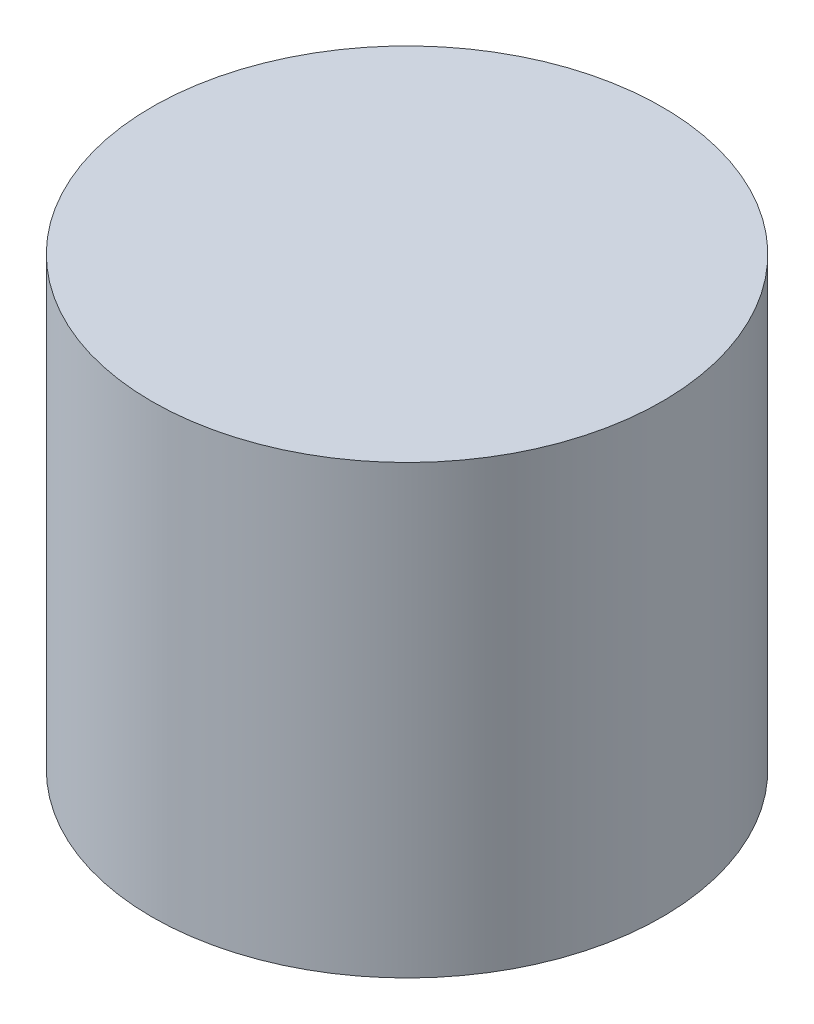
ISO-10303-21;
HEADER;
FILE_DESCRIPTION(('STEP AP214'),'2;1');
FILE_NAME('part.step','',(''),(''),'','','');
FILE_SCHEMA(('AUTOMOTIVE_DESIGN { 1 0 10303 214 1 1 1 1 }'));
ENDSEC;
DATA;
#1=APPLICATION_CONTEXT('core data for automotive mechanical design processes');
#2=APPLICATION_PROTOCOL_DEFINITION('international standard','automotive_design',2000,#1);
#3=PRODUCT_CONTEXT('',#1,'mechanical');
#4=PRODUCT('Part','Part','',(#3));
#5=PRODUCT_RELATED_PRODUCT_CATEGORY('part','',(#4));
#6=PRODUCT_DEFINITION_FORMATION('','',#4);
#7=PRODUCT_DEFINITION_CONTEXT('part definition',#1,'design');
#8=PRODUCT_DEFINITION('design','',#6,#7);
#9=PRODUCT_DEFINITION_SHAPE('','',#8);
#10=(LENGTH_UNIT() NAMED_UNIT(*) SI_UNIT(.MILLI.,.METRE.));
#11=(NAMED_UNIT(*) PLANE_ANGLE_UNIT() SI_UNIT($,.RADIAN.));
#12=(NAMED_UNIT(*) SI_UNIT($,.STERADIAN.) SOLID_ANGLE_UNIT());
#13=UNCERTAINTY_MEASURE_WITH_UNIT(LENGTH_MEASURE(1.E-05),#10,'distance_accuracy_value','');
#14=(GEOMETRIC_REPRESENTATION_CONTEXT(3) GLOBAL_UNCERTAINTY_ASSIGNED_CONTEXT((#13)) GLOBAL_UNIT_ASSIGNED_CONTEXT((#10,
#11,#12)) REPRESENTATION_CONTEXT('',''));
#15=CARTESIAN_POINT('',(0.,0.,0.));
#16=DIRECTION('',(0.,0.,1.));
#17=DIRECTION('',(1.,0.,0.));
#18=AXIS2_PLACEMENT_3D('',#15,#16,#17);
#19=CARTESIAN_POINT('',(0.,14.,0.));
#20=DIRECTION('',(0.,-1.,0.));
#21=DIRECTION('',(0.,0.,-1.));
#22=AXIS2_PLACEMENT_3D('',#19,#20,#21);
#23=CYLINDRICAL_SURFACE('',#22,8.);
#24=CARTESIAN_POINT('',(0.,14.,0.));
#25=DIRECTION('',(0.,1.,0.));
#26=DIRECTION('',(0.,0.,1.));
#27=AXIS2_PLACEMENT_3D('',#24,#25,#26);
#28=CIRCLE('',#27,8.);
#29=CARTESIAN_POINT('',(0.,14.,8.));
#30=VERTEX_POINT('',#29);
#31=EDGE_CURVE('E10',#30,#30,#28,.T.);
#32=ORIENTED_EDGE('',*,*,#31,.F.);
#33=EDGE_LOOP('',(#32));
#34=FACE_BOUND('',#33,.T.);
#35=CARTESIAN_POINT('',(0.,0.,0.));
#36=DIRECTION('',(0.,1.,0.));
#37=DIRECTION('',(0.,0.,1.));
#38=AXIS2_PLACEMENT_3D('',#35,#36,#37);
#39=CIRCLE('',#38,8.);
#40=CARTESIAN_POINT('',(0.,0.,8.));
#41=VERTEX_POINT('',#40);
#42=EDGE_CURVE('E31',#41,#41,#39,.T.);
#43=ORIENTED_EDGE('',*,*,#42,.T.);
#44=EDGE_LOOP('',(#43));
#45=FACE_BOUND('',#44,.T.);
#46=ADVANCED_FACE('F28',(#34,#45),#23,.T.);
#47=CARTESIAN_POINT('',(0.,14.,0.));
#48=DIRECTION('',(0.,1.,0.));
#49=DIRECTION('',(0.,0.,1.));
#50=AXIS2_PLACEMENT_3D('',#47,#48,#49);
#51=PLANE('',#50);
#52=ORIENTED_EDGE('',*,*,#31,.T.);
#53=EDGE_LOOP('',(#52));
#54=FACE_BOUND('',#53,.T.);
#55=ADVANCED_FACE('F43',(#54),#51,.T.);
#56=CARTESIAN_POINT('',(0.,0.,0.));
#57=DIRECTION('',(0.,1.,0.));
#58=DIRECTION('',(0.,0.,1.));
#59=AXIS2_PLACEMENT_3D('',#56,#57,#58);
#60=PLANE('',#59);
#61=ORIENTED_EDGE('',*,*,#42,.F.);
#62=EDGE_LOOP('',(#61));
#63=FACE_BOUND('',#62,.T.);
#64=ADVANCED_FACE('F41',(#63),#60,.F.);
#65=CLOSED_SHELL('',(#46,#55,#64));
#66=MANIFOLD_SOLID_BREP('B2',#65);
#67=ADVANCED_BREP_SHAPE_REPRESENTATION('',(#18,#66),#14);
#68=SHAPE_DEFINITION_REPRESENTATION(#9,#67);
ENDSEC;
END-ISO-10303-21;
